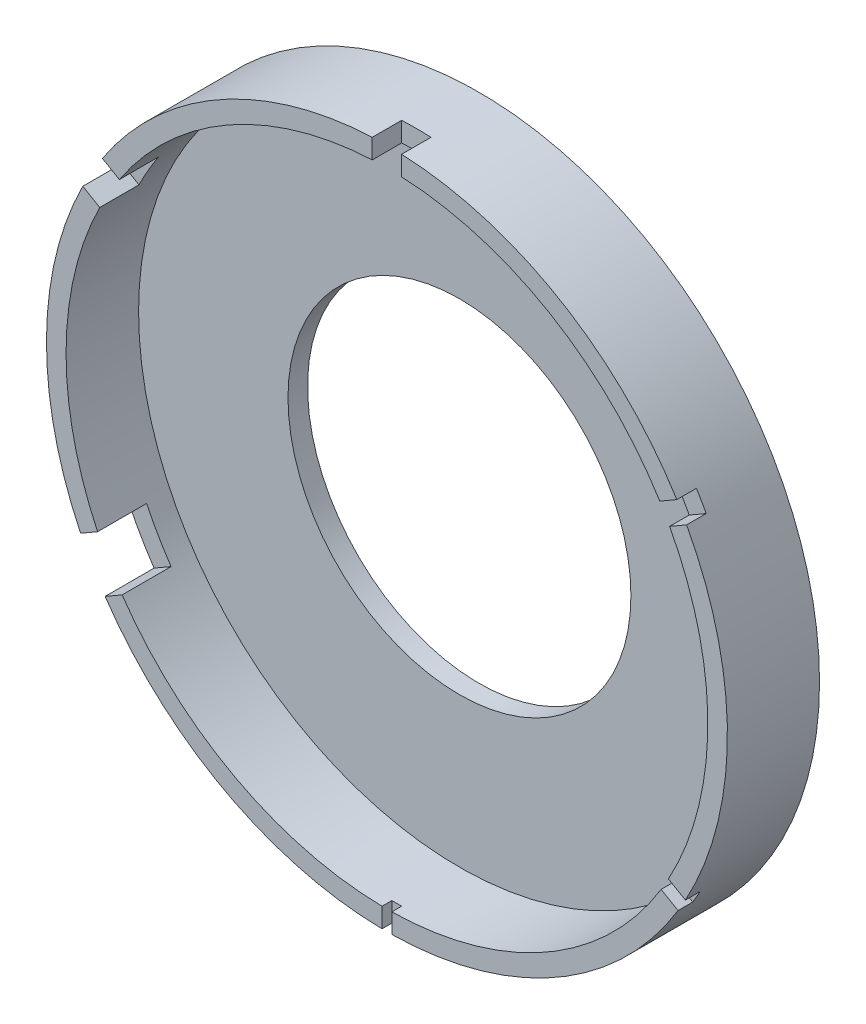
ISO-10303-21;
HEADER;
FILE_DESCRIPTION(('STEP AP214'),'2;1');
FILE_NAME('part.step','',(''),(''),'','','');
FILE_SCHEMA(('AUTOMOTIVE_DESIGN { 1 0 10303 214 1 1 1 1 }'));
ENDSEC;
DATA;
#1=APPLICATION_CONTEXT('core data for automotive mechanical design processes');
#2=APPLICATION_PROTOCOL_DEFINITION('international standard','automotive_design',2000,#1);
#3=PRODUCT_CONTEXT('',#1,'mechanical');
#4=PRODUCT('Part','Part','',(#3));
#5=PRODUCT_RELATED_PRODUCT_CATEGORY('part','',(#4));
#6=PRODUCT_DEFINITION_FORMATION('','',#4);
#7=PRODUCT_DEFINITION_CONTEXT('part definition',#1,'design');
#8=PRODUCT_DEFINITION('design','',#6,#7);
#9=PRODUCT_DEFINITION_SHAPE('','',#8);
#10=(LENGTH_UNIT() NAMED_UNIT(*) SI_UNIT(.MILLI.,.METRE.));
#11=(NAMED_UNIT(*) PLANE_ANGLE_UNIT() SI_UNIT($,.RADIAN.));
#12=(NAMED_UNIT(*) SI_UNIT($,.STERADIAN.) SOLID_ANGLE_UNIT());
#13=UNCERTAINTY_MEASURE_WITH_UNIT(LENGTH_MEASURE(1.E-05),#10,'distance_accuracy_value','');
#14=(GEOMETRIC_REPRESENTATION_CONTEXT(3) GLOBAL_UNCERTAINTY_ASSIGNED_CONTEXT((#13)) GLOBAL_UNIT_ASSIGNED_CONTEXT((#10,
#11,#12)) REPRESENTATION_CONTEXT('',''));
#15=CARTESIAN_POINT('',(0.,0.,0.));
#16=DIRECTION('',(0.,0.,1.));
#17=DIRECTION('',(1.,0.,0.));
#18=AXIS2_PLACEMENT_3D('',#15,#16,#17);
#19=CARTESIAN_POINT('',(0.,0.,9.4));
#20=DIRECTION('',(0.,0.,1.));
#21=DIRECTION('',(1.,0.,0.));
#22=AXIS2_PLACEMENT_3D('',#19,#20,#21);
#23=PLANE('',#22);
#24=DIRECTION('',(-0.866025403784436,-0.500000000000005,0.));
#25=VECTOR('',#24,1.);
#26=CARTESIAN_POINT('',(-29.5295752266542,-14.1621568602162,9.4));
#27=LINE('',#26,#25);
#28=CARTESIAN_POINT('',(-29.5295752266542,-14.1621568602162,9.4));
#29=VERTEX_POINT('',#28);
#30=CARTESIAN_POINT('',(-31.2664017663676,-15.1649141304554,9.4));
#31=VERTEX_POINT('',#30);
#32=EDGE_CURVE('E437',#29,#31,#27,.T.);
#33=ORIENTED_EDGE('',*,*,#32,.F.);
#34=CARTESIAN_POINT('',(0.,0.,9.4));
#35=DIRECTION('',(0.,0.,1.));
#36=DIRECTION('',(1.,0.,0.));
#37=AXIS2_PLACEMENT_3D('',#34,#35,#36);
#38=CIRCLE('',#37,32.75);
#39=CARTESIAN_POINT('',(-29.3093955251609,14.6123863194783,9.4));
#40=VERTEX_POINT('',#39);
#41=EDGE_CURVE('E343',#40,#29,#38,.T.);
#42=ORIENTED_EDGE('',*,*,#41,.F.);
#43=DIRECTION('',(0.866025403784441,-0.499999999999997,0.));
#44=VECTOR('',#43,1.);
#45=CARTESIAN_POINT('',(-29.3093955251609,14.6123863194783,9.4));
#46=LINE('',#45,#44);
#47=CARTESIAN_POINT('',(-31.0444982484315,15.6141483438302,9.4));
#48=VERTEX_POINT('',#47);
#49=EDGE_CURVE('E219',#48,#40,#46,.T.);
#50=ORIENTED_EDGE('',*,*,#49,.F.);
#51=CARTESIAN_POINT('',(0.,0.,9.4));
#52=DIRECTION('',(0.,0.,1.));
#53=DIRECTION('',(1.,0.,0.));
#54=AXIS2_PLACEMENT_3D('',#51,#52,#53);
#55=CIRCLE('',#54,34.75);
#56=EDGE_CURVE('E440',#48,#31,#55,.T.);
#57=ORIENTED_EDGE('',*,*,#56,.T.);
#58=EDGE_LOOP('',(#33,#42,#50,#57));
#59=FACE_BOUND('',#58,.T.);
#60=ADVANCED_FACE('F33',(#59),#23,.T.);
#61=DIRECTION('',(-0.86602540378444,0.499999999999998,0.));
#62=VECTOR('',#61,1.);
#63=CARTESIAN_POINT('',(-27.309395525161,18.076487934616,9.4));
#64=LINE('',#63,#62);
#65=CARTESIAN_POINT('',(-27.309395525161,18.076487934616,9.4));
#66=VERTEX_POINT('',#65);
#67=CARTESIAN_POINT('',(-29.0444982484315,19.0782499589679,9.4));
#68=VERTEX_POINT('',#67);
#69=EDGE_CURVE('E217',#66,#68,#64,.T.);
#70=ORIENTED_EDGE('',*,*,#69,.F.);
#71=CARTESIAN_POINT('',(-1.5,32.715630820756,9.4));
#72=VERTEX_POINT('',#71);
#73=EDGE_CURVE('E339',#72,#66,#38,.T.);
#74=ORIENTED_EDGE('',*,*,#73,.F.);
#75=DIRECTION('',(0.,-1.,0.));
#76=VECTOR('',#75,1.);
#77=CARTESIAN_POINT('',(-1.5,32.715630820756,9.4));
#78=LINE('',#77,#76);
#79=CARTESIAN_POINT('',(-1.5,34.7176108048927,9.4));
#80=VERTEX_POINT('',#79);
#81=EDGE_CURVE('E239',#80,#72,#78,.T.);
#82=ORIENTED_EDGE('',*,*,#81,.F.);
#83=EDGE_CURVE('E451',#80,#68,#55,.T.);
#84=ORIENTED_EDGE('',*,*,#83,.T.);
#85=EDGE_LOOP('',(#70,#74,#82,#84));
#86=FACE_BOUND('',#85,.T.);
#87=ADVANCED_FACE('F427',(#86),#23,.T.);
#88=DIRECTION('',(0.,1.,0.));
#89=VECTOR('',#88,1.);
#90=CARTESIAN_POINT('',(1.5,32.715630820756,9.4));
#91=LINE('',#90,#89);
#92=CARTESIAN_POINT('',(1.5,32.715630820756,9.4));
#93=VERTEX_POINT('',#92);
#94=CARTESIAN_POINT('',(1.5,34.7176108048927,9.4));
#95=VERTEX_POINT('',#94);
#96=EDGE_CURVE('E235',#93,#95,#91,.T.);
#97=ORIENTED_EDGE('',*,*,#96,.F.);
#98=CARTESIAN_POINT('',(27.8491071287967,17.233390035881,9.4));
#99=VERTEX_POINT('',#98);
#100=EDGE_CURVE('E335',#99,#93,#38,.T.);
#101=ORIENTED_EDGE('',*,*,#100,.F.);
#102=DIRECTION('',(-0.866025403784435,-0.500000000000005,0.));
#103=VECTOR('',#102,1.);
#104=CARTESIAN_POINT('',(27.8491071287967,17.233390035881,9.4));
#105=LINE('',#104,#103);
#106=CARTESIAN_POINT('',(29.581919403522,18.2338296691488,9.4));
#107=VERTEX_POINT('',#106);
#108=EDGE_CURVE('E255',#107,#99,#105,.T.);
#109=ORIENTED_EDGE('',*,*,#108,.F.);
#110=EDGE_CURVE('E453',#107,#95,#55,.T.);
#111=ORIENTED_EDGE('',*,*,#110,.T.);
#112=EDGE_LOOP('',(#97,#101,#109,#111));
#113=FACE_BOUND('',#112,.T.);
#114=ADVANCED_FACE('F432',(#113),#23,.T.);
#115=DIRECTION('',(0.866025403784435,0.500000000000007,0.));
#116=VECTOR('',#115,1.);
#117=CARTESIAN_POINT('',(28.8491071287967,15.5013392283122,9.4));
#118=LINE('',#117,#116);
#119=CARTESIAN_POINT('',(28.8491071287967,15.5013392283122,9.4));
#120=VERTEX_POINT('',#119);
#121=CARTESIAN_POINT('',(30.581919403522,16.5017788615799,9.4));
#122=VERTEX_POINT('',#121);
#123=EDGE_CURVE('E251',#120,#122,#118,.T.);
#124=ORIENTED_EDGE('',*,*,#123,.F.);
#125=CARTESIAN_POINT('',(28.7298937575157,-15.7211864909065,9.4));
#126=VERTEX_POINT('',#125);
#127=EDGE_CURVE('E321',#126,#120,#38,.T.);
#128=ORIENTED_EDGE('',*,*,#127,.F.);
#129=DIRECTION('',(-0.86602540378444,0.499999999999998,0.));
#130=VECTOR('',#129,1.);
#131=CARTESIAN_POINT('',(28.7298937575157,-15.7211864909065,9.4));
#132=LINE('',#131,#130);
#133=CARTESIAN_POINT('',(30.4623727666608,-16.7214337132018,9.4));
#134=VERTEX_POINT('',#133);
#135=EDGE_CURVE('E271',#134,#126,#132,.T.);
#136=ORIENTED_EDGE('',*,*,#135,.F.);
#137=EDGE_CURVE('E299',#134,#122,#55,.T.);
#138=ORIENTED_EDGE('',*,*,#137,.T.);
#139=EDGE_LOOP('',(#124,#128,#136,#138));
#140=FACE_BOUND('',#139,.T.);
#141=ADVANCED_FACE('F467',(#140),#23,.T.);
#142=DIRECTION('',(0.86602540378444,-0.499999999999998,0.));
#143=VECTOR('',#142,1.);
#144=CARTESIAN_POINT('',(27.9798937575157,-17.0202245965832,9.4));
#145=LINE('',#144,#143);
#146=CARTESIAN_POINT('',(27.9798937575157,-17.0202245965832,9.4));
#147=VERTEX_POINT('',#146);
#148=CARTESIAN_POINT('',(29.7123727666608,-18.0204718188785,9.4));
#149=VERTEX_POINT('',#148);
#150=EDGE_CURVE('E267',#147,#149,#145,.T.);
#151=ORIENTED_EDGE('',*,*,#150,.F.);
#152=CARTESIAN_POINT('',(0.5,-32.74618298367,9.4));
#153=VERTEX_POINT('',#152);
#154=EDGE_CURVE('E304',#153,#147,#38,.T.);
#155=ORIENTED_EDGE('',*,*,#154,.F.);
#156=DIRECTION('',(0.,1.,0.));
#157=VECTOR('',#156,1.);
#158=CARTESIAN_POINT('',(0.5,-32.74618298367,9.4));
#159=LINE('',#158,#157);
#160=CARTESIAN_POINT('',(0.5,-34.7464026915018,9.4));
#161=VERTEX_POINT('',#160);
#162=EDGE_CURVE('E293',#161,#153,#159,.T.);
#163=ORIENTED_EDGE('',*,*,#162,.F.);
#164=EDGE_CURVE('E295',#161,#149,#55,.T.);
#165=ORIENTED_EDGE('',*,*,#164,.T.);
#166=EDGE_LOOP('',(#151,#155,#163,#165));
#167=FACE_BOUND('',#166,.T.);
#168=ADVANCED_FACE('F386',(#167),#23,.T.);
#169=CARTESIAN_POINT('',(0.,0.,9.4));
#170=DIRECTION('',(0.,0.,-1.));
#171=DIRECTION('',(-1.,0.,0.));
#172=AXIS2_PLACEMENT_3D('',#169,#170,#171);
#173=CYLINDRICAL_SURFACE('',#172,32.75);
#174=DIRECTION('',(0.,0.,1.));
#175=VECTOR('',#174,1.);
#176=CARTESIAN_POINT('',(-29.5295752266542,-14.1621568602162,4.4));
#177=LINE('',#176,#175);
#178=CARTESIAN_POINT('',(-29.5295752266542,-14.1621568602162,4.4));
#179=VERTEX_POINT('',#178);
#180=EDGE_CURVE('E211',#179,#29,#177,.T.);
#181=ORIENTED_EDGE('',*,*,#180,.F.);
#182=CARTESIAN_POINT('',(0.,0.,4.4));
#183=DIRECTION('',(0.,0.,1.));
#184=DIRECTION('',(1.,0.,0.));
#185=AXIS2_PLACEMENT_3D('',#182,#183,#184);
#186=CIRCLE('',#185,32.75);
#187=CARTESIAN_POINT('',(-27.0295752266542,-18.4922838791384,4.4));
#188=VERTEX_POINT('',#187);
#189=EDGE_CURVE('E198',#179,#188,#186,.T.);
#190=ORIENTED_EDGE('',*,*,#189,.T.);
#191=DIRECTION('',(0.,0.,1.));
#192=VECTOR('',#191,1.);
#193=CARTESIAN_POINT('',(-27.0295752266542,-18.4922838791384,4.4));
#194=LINE('',#193,#192);
#195=CARTESIAN_POINT('',(-27.0295752266542,-18.4922838791384,9.4));
#196=VERTEX_POINT('',#195);
#197=EDGE_CURVE('E203',#188,#196,#194,.T.);
#198=ORIENTED_EDGE('',*,*,#197,.T.);
#199=CARTESIAN_POINT('',(-0.5,-32.74618298367,9.4));
#200=VERTEX_POINT('',#199);
#201=EDGE_CURVE('E308',#196,#200,#38,.T.);
#202=ORIENTED_EDGE('',*,*,#201,.T.);
#203=DIRECTION('',(0.,0.,1.));
#204=VECTOR('',#203,1.);
#205=CARTESIAN_POINT('',(-0.5,-32.74618298367,8.4));
#206=LINE('',#205,#204);
#207=CARTESIAN_POINT('',(-0.5,-32.74618298367,8.4));
#208=VERTEX_POINT('',#207);
#209=EDGE_CURVE('E351',#208,#200,#206,.T.);
#210=ORIENTED_EDGE('',*,*,#209,.F.);
#211=CARTESIAN_POINT('',(0.50000000000001,-32.74618298367,8.4));
#212=CARTESIAN_POINT('',(-2.15105711021124E-13,-32.7538174612555,8.4));
#213=CARTESIAN_POINT('',(-0.499999999999998,-32.74618298367,8.4));
#214=B_SPLINE_CURVE_WITH_KNOTS('',2,(#211,#212,#213),.UNSPECIFIED.,.F.,.F.,(3,3),(0.,1.),.UNSPECIFIED.);
#215=CARTESIAN_POINT('',(0.5,-32.74618298367,8.4));
#216=VERTEX_POINT('',#215);
#217=EDGE_CURVE('E309',#216,#208,#214,.T.);
#218=ORIENTED_EDGE('',*,*,#217,.F.);
#219=DIRECTION('',(0.,0.,1.));
#220=VECTOR('',#219,1.);
#221=CARTESIAN_POINT('',(0.5,-32.74618298367,8.4));
#222=LINE('',#221,#220);
#223=EDGE_CURVE('E359',#216,#153,#222,.T.);
#224=ORIENTED_EDGE('',*,*,#223,.T.);
#225=ORIENTED_EDGE('',*,*,#154,.T.);
#226=DIRECTION('',(0.,0.,1.));
#227=VECTOR('',#226,1.);
#228=CARTESIAN_POINT('',(27.9798937575157,-17.0202245965832,7.9));
#229=LINE('',#228,#227);
#230=CARTESIAN_POINT('',(27.9798937575157,-17.0202245965832,7.9));
#231=VERTEX_POINT('',#230);
#232=EDGE_CURVE('E276',#231,#147,#229,.T.);
#233=ORIENTED_EDGE('',*,*,#232,.F.);
#234=CARTESIAN_POINT('',(0.,0.,7.9));
#235=DIRECTION('',(0.,0.,1.));
#236=DIRECTION('',(1.,0.,0.));
#237=AXIS2_PLACEMENT_3D('',#234,#235,#236);
#238=CIRCLE('',#237,32.75);
#239=CARTESIAN_POINT('',(28.7298937575157,-15.7211864909065,7.9));
#240=VERTEX_POINT('',#239);
#241=EDGE_CURVE('E278',#231,#240,#238,.T.);
#242=ORIENTED_EDGE('',*,*,#241,.T.);
#243=DIRECTION('',(0.,0.,1.));
#244=VECTOR('',#243,1.);
#245=CARTESIAN_POINT('',(28.7298937575157,-15.7211864909065,7.9));
#246=LINE('',#245,#244);
#247=EDGE_CURVE('E273',#240,#126,#246,.T.);
#248=ORIENTED_EDGE('',*,*,#247,.T.);
#249=ORIENTED_EDGE('',*,*,#127,.T.);
#250=DIRECTION('',(0.,0.,1.));
#251=VECTOR('',#250,1.);
#252=CARTESIAN_POINT('',(28.8491071287967,15.5013392283122,7.4));
#253=LINE('',#252,#251);
#254=CARTESIAN_POINT('',(28.8491071287967,15.5013392283122,7.4));
#255=VERTEX_POINT('',#254);
#256=EDGE_CURVE('E260',#255,#120,#253,.T.);
#257=ORIENTED_EDGE('',*,*,#256,.F.);
#258=CARTESIAN_POINT('',(0.,0.,7.4));
#259=DIRECTION('',(0.,0.,1.));
#260=DIRECTION('',(1.,0.,0.));
#261=AXIS2_PLACEMENT_3D('',#258,#259,#260);
#262=CIRCLE('',#261,32.75);
#263=CARTESIAN_POINT('',(27.8491071287967,17.233390035881,7.4));
#264=VERTEX_POINT('',#263);
#265=EDGE_CURVE('E262',#255,#264,#262,.T.);
#266=ORIENTED_EDGE('',*,*,#265,.T.);
#267=DIRECTION('',(0.,0.,1.));
#268=VECTOR('',#267,1.);
#269=CARTESIAN_POINT('',(27.8491071287967,17.233390035881,7.4));
#270=LINE('',#269,#268);
#271=EDGE_CURVE('E257',#264,#99,#270,.T.);
#272=ORIENTED_EDGE('',*,*,#271,.T.);
#273=ORIENTED_EDGE('',*,*,#100,.T.);
#274=DIRECTION('',(0.,0.,1.));
#275=VECTOR('',#274,1.);
#276=CARTESIAN_POINT('',(1.5,32.715630820756,6.4));
#277=LINE('',#276,#275);
#278=CARTESIAN_POINT('',(1.5,32.715630820756,6.4));
#279=VERTEX_POINT('',#278);
#280=EDGE_CURVE('E244',#279,#93,#277,.T.);
#281=ORIENTED_EDGE('',*,*,#280,.F.);
#282=CARTESIAN_POINT('',(0.,0.,6.4));
#283=DIRECTION('',(0.,0.,1.));
#284=DIRECTION('',(1.,0.,0.));
#285=AXIS2_PLACEMENT_3D('',#282,#283,#284);
#286=CIRCLE('',#285,32.75);
#287=CARTESIAN_POINT('',(-1.5,32.715630820756,6.4));
#288=VERTEX_POINT('',#287);
#289=EDGE_CURVE('E246',#279,#288,#286,.T.);
#290=ORIENTED_EDGE('',*,*,#289,.T.);
#291=DIRECTION('',(0.,0.,1.));
#292=VECTOR('',#291,1.);
#293=CARTESIAN_POINT('',(-1.5,32.715630820756,6.4));
#294=LINE('',#293,#292);
#295=EDGE_CURVE('E241',#288,#72,#294,.T.);
#296=ORIENTED_EDGE('',*,*,#295,.T.);
#297=ORIENTED_EDGE('',*,*,#73,.T.);
#298=DIRECTION('',(0.,0.,1.));
#299=VECTOR('',#298,1.);
#300=CARTESIAN_POINT('',(-27.309395525161,18.076487934616,5.4));
#301=LINE('',#300,#299);
#302=CARTESIAN_POINT('',(-27.309395525161,18.076487934616,5.4));
#303=VERTEX_POINT('',#302);
#304=EDGE_CURVE('E228',#303,#66,#301,.T.);
#305=ORIENTED_EDGE('',*,*,#304,.F.);
#306=CARTESIAN_POINT('',(0.,0.,5.4));
#307=DIRECTION('',(0.,0.,1.));
#308=DIRECTION('',(1.,0.,0.));
#309=AXIS2_PLACEMENT_3D('',#306,#307,#308);
#310=CIRCLE('',#309,32.75);
#311=CARTESIAN_POINT('',(-29.3093955251609,14.6123863194783,5.4));
#312=VERTEX_POINT('',#311);
#313=EDGE_CURVE('E230',#303,#312,#310,.T.);
#314=ORIENTED_EDGE('',*,*,#313,.T.);
#315=DIRECTION('',(0.,0.,1.));
#316=VECTOR('',#315,1.);
#317=CARTESIAN_POINT('',(-29.3093955251609,14.6123863194783,5.4));
#318=LINE('',#317,#316);
#319=EDGE_CURVE('E225',#312,#40,#318,.T.);
#320=ORIENTED_EDGE('',*,*,#319,.T.);
#321=ORIENTED_EDGE('',*,*,#41,.T.);
#322=EDGE_LOOP('',(#181,#190,#198,#202,#210,#218,#224,#225,#233,#242,#248,#249,#257,#266,#272,
#273,#281,#290,#296,#297,#305,#314,#320,#321));
#323=FACE_BOUND('',#322,.T.);
#324=CARTESIAN_POINT('',(0.,0.,2.));
#325=DIRECTION('',(0.,0.,-1.));
#326=DIRECTION('',(-1.,0.,0.));
#327=AXIS2_PLACEMENT_3D('',#324,#325,#326);
#328=CIRCLE('',#327,32.75);
#329=CARTESIAN_POINT('',(-32.75,0.,2.));
#330=VERTEX_POINT('',#329);
#331=EDGE_CURVE('E305',#330,#330,#328,.T.);
#332=ORIENTED_EDGE('',*,*,#331,.T.);
#333=EDGE_LOOP('',(#332));
#334=FACE_BOUND('',#333,.T.);
#335=ADVANCED_FACE('F214',(#323,#334),#173,.F.);
#336=DIRECTION('',(0.866025403784437,0.500000000000002,0.));
#337=VECTOR('',#336,1.);
#338=CARTESIAN_POINT('',(-27.0295752266542,-18.4922838791384,9.4));
#339=LINE('',#338,#337);
#340=CARTESIAN_POINT('',(-28.7664017663676,-19.4950411493776,9.4));
#341=VERTEX_POINT('',#340);
#342=EDGE_CURVE('E208',#341,#196,#339,.T.);
#343=ORIENTED_EDGE('',*,*,#342,.F.);
#344=CARTESIAN_POINT('',(-0.5,-34.7464026915018,9.4));
#345=VERTEX_POINT('',#344);
#346=EDGE_CURVE('E300',#341,#345,#55,.T.);
#347=ORIENTED_EDGE('',*,*,#346,.T.);
#348=DIRECTION('',(0.,-1.,0.));
#349=VECTOR('',#348,1.);
#350=CARTESIAN_POINT('',(-0.5,-32.74618298367,9.4));
#351=LINE('',#350,#349);
#352=EDGE_CURVE('E283',#200,#345,#351,.T.);
#353=ORIENTED_EDGE('',*,*,#352,.F.);
#354=ORIENTED_EDGE('',*,*,#201,.F.);
#355=EDGE_LOOP('',(#343,#347,#353,#354));
#356=FACE_BOUND('',#355,.T.);
#357=ADVANCED_FACE('F361',(#356),#23,.T.);
#358=CARTESIAN_POINT('',(0.,0.,0.));
#359=DIRECTION('',(0.,0.,1.));
#360=DIRECTION('',(1.,0.,0.));
#361=AXIS2_PLACEMENT_3D('',#358,#359,#360);
#362=PLANE('',#361);
#363=CARTESIAN_POINT('',(0.,0.,0.));
#364=DIRECTION('',(0.,0.,1.));
#365=DIRECTION('',(1.,0.,0.));
#366=AXIS2_PLACEMENT_3D('',#363,#364,#365);
#367=CIRCLE('',#366,17.5);
#368=CARTESIAN_POINT('',(17.5,0.,0.));
#369=VERTEX_POINT('',#368);
#370=EDGE_CURVE('E746',#369,#369,#367,.T.);
#371=ORIENTED_EDGE('',*,*,#370,.T.);
#372=EDGE_LOOP('',(#371));
#373=FACE_BOUND('',#372,.T.);
#374=CARTESIAN_POINT('',(0.,0.,0.));
#375=DIRECTION('',(0.,0.,1.));
#376=DIRECTION('',(1.,0.,0.));
#377=AXIS2_PLACEMENT_3D('',#374,#375,#376);
#378=CIRCLE('',#377,34.75);
#379=CARTESIAN_POINT('',(34.75,0.,0.));
#380=VERTEX_POINT('',#379);
#381=EDGE_CURVE('E301',#380,#380,#378,.T.);
#382=ORIENTED_EDGE('',*,*,#381,.F.);
#383=EDGE_LOOP('',(#382));
#384=FACE_BOUND('',#383,.T.);
#385=ADVANCED_FACE('F416',(#373,#384),#362,.F.);
#386=CARTESIAN_POINT('',(0.,0.,9.4));
#387=DIRECTION('',(0.,0.,-1.));
#388=DIRECTION('',(-1.,0.,0.));
#389=AXIS2_PLACEMENT_3D('',#386,#387,#388);
#390=CYLINDRICAL_SURFACE('',#389,34.75);
#391=CARTESIAN_POINT('',(0.,0.,4.4));
#392=DIRECTION('',(0.,0.,1.));
#393=DIRECTION('',(1.,0.,0.));
#394=AXIS2_PLACEMENT_3D('',#391,#392,#393);
#395=CIRCLE('',#394,34.75);
#396=CARTESIAN_POINT('',(-31.2664017663676,-15.1649141304554,4.4));
#397=VERTEX_POINT('',#396);
#398=CARTESIAN_POINT('',(-28.7664017663676,-19.4950411493776,4.4));
#399=VERTEX_POINT('',#398);
#400=EDGE_CURVE('E200',#397,#399,#395,.T.);
#401=ORIENTED_EDGE('',*,*,#400,.F.);
#402=DIRECTION('',(0.,0.,-1.));
#403=VECTOR('',#402,1.);
#404=CARTESIAN_POINT('',(-31.2664017663676,-15.1649141304554,9.4));
#405=LINE('',#404,#403);
#406=EDGE_CURVE('E11',#397,#31,#405,.F.);
#407=ORIENTED_EDGE('',*,*,#406,.T.);
#408=ORIENTED_EDGE('',*,*,#56,.F.);
#409=DIRECTION('',(0.,0.,-1.));
#410=VECTOR('',#409,1.);
#411=CARTESIAN_POINT('',(-31.0444982484315,15.6141483438302,9.4));
#412=LINE('',#411,#410);
#413=CARTESIAN_POINT('',(-31.0444982484315,15.6141483438302,5.4));
#414=VERTEX_POINT('',#413);
#415=EDGE_CURVE('E449',#48,#414,#412,.T.);
#416=ORIENTED_EDGE('',*,*,#415,.T.);
#417=CARTESIAN_POINT('',(0.,0.,5.4));
#418=DIRECTION('',(0.,0.,1.));
#419=DIRECTION('',(1.,0.,0.));
#420=AXIS2_PLACEMENT_3D('',#417,#418,#419);
#421=CIRCLE('',#420,34.75);
#422=CARTESIAN_POINT('',(-29.0444982484315,19.0782499589679,5.4));
#423=VERTEX_POINT('',#422);
#424=EDGE_CURVE('E495',#423,#414,#421,.T.);
#425=ORIENTED_EDGE('',*,*,#424,.F.);
#426=DIRECTION('',(0.,0.,-1.));
#427=VECTOR('',#426,1.);
#428=CARTESIAN_POINT('',(-29.0444982484315,19.0782499589679,9.4));
#429=LINE('',#428,#427);
#430=EDGE_CURVE('E346',#423,#68,#429,.F.);
#431=ORIENTED_EDGE('',*,*,#430,.T.);
#432=ORIENTED_EDGE('',*,*,#83,.F.);
#433=DIRECTION('',(0.,0.,-1.));
#434=VECTOR('',#433,1.);
#435=CARTESIAN_POINT('',(-1.5,34.7176108048927,9.4));
#436=LINE('',#435,#434);
#437=CARTESIAN_POINT('',(-1.5,34.7176108048927,6.4));
#438=VERTEX_POINT('',#437);
#439=EDGE_CURVE('E478',#80,#438,#436,.T.);
#440=ORIENTED_EDGE('',*,*,#439,.T.);
#441=CARTESIAN_POINT('',(0.,0.,6.4));
#442=DIRECTION('',(0.,0.,1.));
#443=DIRECTION('',(1.,0.,0.));
#444=AXIS2_PLACEMENT_3D('',#441,#442,#443);
#445=CIRCLE('',#444,34.75);
#446=CARTESIAN_POINT('',(1.5,34.7176108048927,6.4));
#447=VERTEX_POINT('',#446);
#448=EDGE_CURVE('E477',#447,#438,#445,.T.);
#449=ORIENTED_EDGE('',*,*,#448,.F.);
#450=DIRECTION('',(0.,0.,-1.));
#451=VECTOR('',#450,1.);
#452=CARTESIAN_POINT('',(1.5,34.7176108048927,9.4));
#453=LINE('',#452,#451);
#454=EDGE_CURVE('E496',#447,#95,#453,.F.);
#455=ORIENTED_EDGE('',*,*,#454,.T.);
#456=ORIENTED_EDGE('',*,*,#110,.F.);
#457=DIRECTION('',(0.,0.,-1.));
#458=VECTOR('',#457,1.);
#459=CARTESIAN_POINT('',(29.581919403522,18.2338296691488,9.4));
#460=LINE('',#459,#458);
#461=CARTESIAN_POINT('',(29.581919403522,18.2338296691488,7.4));
#462=VERTEX_POINT('',#461);
#463=EDGE_CURVE('E398',#107,#462,#460,.T.);
#464=ORIENTED_EDGE('',*,*,#463,.T.);
#465=CARTESIAN_POINT('',(0.,0.,7.4));
#466=DIRECTION('',(0.,0.,1.));
#467=DIRECTION('',(1.,0.,0.));
#468=AXIS2_PLACEMENT_3D('',#465,#466,#467);
#469=CIRCLE('',#468,34.75);
#470=CARTESIAN_POINT('',(30.581919403522,16.5017788615799,7.4));
#471=VERTEX_POINT('',#470);
#472=EDGE_CURVE('E396',#471,#462,#469,.T.);
#473=ORIENTED_EDGE('',*,*,#472,.F.);
#474=DIRECTION('',(0.,0.,-1.));
#475=VECTOR('',#474,1.);
#476=CARTESIAN_POINT('',(30.581919403522,16.5017788615799,9.4));
#477=LINE('',#476,#475);
#478=EDGE_CURVE('E473',#471,#122,#477,.F.);
#479=ORIENTED_EDGE('',*,*,#478,.T.);
#480=ORIENTED_EDGE('',*,*,#137,.F.);
#481=DIRECTION('',(0.,0.,-1.));
#482=VECTOR('',#481,1.);
#483=CARTESIAN_POINT('',(30.4623727666608,-16.7214337132018,9.4));
#484=LINE('',#483,#482);
#485=CARTESIAN_POINT('',(30.4623727666608,-16.7214337132018,7.9));
#486=VERTEX_POINT('',#485);
#487=EDGE_CURVE('E397',#134,#486,#484,.T.);
#488=ORIENTED_EDGE('',*,*,#487,.T.);
#489=CARTESIAN_POINT('',(0.,0.,7.9));
#490=DIRECTION('',(0.,0.,1.));
#491=DIRECTION('',(1.,0.,0.));
#492=AXIS2_PLACEMENT_3D('',#489,#490,#491);
#493=CIRCLE('',#492,34.75);
#494=CARTESIAN_POINT('',(29.7123727666608,-18.0204718188785,7.9));
#495=VERTEX_POINT('',#494);
#496=EDGE_CURVE('E318',#495,#486,#493,.T.);
#497=ORIENTED_EDGE('',*,*,#496,.F.);
#498=DIRECTION('',(0.,0.,-1.));
#499=VECTOR('',#498,1.);
#500=CARTESIAN_POINT('',(29.7123727666608,-18.0204718188785,9.4));
#501=LINE('',#500,#499);
#502=EDGE_CURVE('E392',#495,#149,#501,.F.);
#503=ORIENTED_EDGE('',*,*,#502,.T.);
#504=ORIENTED_EDGE('',*,*,#164,.F.);
#505=DIRECTION('',(0.,0.,-1.));
#506=VECTOR('',#505,1.);
#507=CARTESIAN_POINT('',(0.5,-34.7464026915018,9.4));
#508=LINE('',#507,#506);
#509=CARTESIAN_POINT('',(0.5,-34.7464026915018,8.4));
#510=VERTEX_POINT('',#509);
#511=EDGE_CURVE('E315',#161,#510,#508,.T.);
#512=ORIENTED_EDGE('',*,*,#511,.T.);
#513=CARTESIAN_POINT('',(0.,0.,8.4));
#514=DIRECTION('',(0.,0.,-1.));
#515=DIRECTION('',(-1.,0.,0.));
#516=AXIS2_PLACEMENT_3D('',#513,#514,#515);
#517=CIRCLE('',#516,34.75);
#518=CARTESIAN_POINT('',(-0.5,-34.7464026915018,8.4));
#519=VERTEX_POINT('',#518);
#520=EDGE_CURVE('E298',#510,#519,#517,.T.);
#521=ORIENTED_EDGE('',*,*,#520,.T.);
#522=DIRECTION('',(0.,0.,-1.));
#523=VECTOR('',#522,1.);
#524=CARTESIAN_POINT('',(-0.5,-34.7464026915018,9.4));
#525=LINE('',#524,#523);
#526=EDGE_CURVE('E312',#519,#345,#525,.F.);
#527=ORIENTED_EDGE('',*,*,#526,.T.);
#528=ORIENTED_EDGE('',*,*,#346,.F.);
#529=DIRECTION('',(0.,0.,-1.));
#530=VECTOR('',#529,1.);
#531=CARTESIAN_POINT('',(-28.7664017663676,-19.4950411493776,9.4));
#532=LINE('',#531,#530);
#533=EDGE_CURVE('E42',#341,#399,#532,.T.);
#534=ORIENTED_EDGE('',*,*,#533,.T.);
#535=EDGE_LOOP('',(#401,#407,#408,#416,#425,#431,#432,#440,#449,#455,#456,#464,#473,#479,#480,
#488,#497,#503,#504,#512,#521,#527,#528,#534));
#536=FACE_BOUND('',#535,.T.);
#537=ORIENTED_EDGE('',*,*,#381,.T.);
#538=EDGE_LOOP('',(#537));
#539=FACE_BOUND('',#538,.T.);
#540=ADVANCED_FACE('F35',(#536,#539),#390,.T.);
#541=CARTESIAN_POINT('',(0.,0.,2.));
#542=DIRECTION('',(0.,0.,-1.));
#543=DIRECTION('',(-1.,0.,0.));
#544=AXIS2_PLACEMENT_3D('',#541,#542,#543);
#545=PLANE('',#544);
#546=CARTESIAN_POINT('',(0.,0.,2.));
#547=DIRECTION('',(0.,0.,-1.));
#548=DIRECTION('',(-1.,0.,0.));
#549=AXIS2_PLACEMENT_3D('',#546,#547,#548);
#550=CIRCLE('',#549,17.5);
#551=CARTESIAN_POINT('',(-17.5,0.,2.));
#552=VERTEX_POINT('',#551);
#553=EDGE_CURVE('E37',#552,#552,#550,.T.);
#554=ORIENTED_EDGE('',*,*,#553,.T.);
#555=EDGE_LOOP('',(#554));
#556=FACE_BOUND('',#555,.T.);
#557=ORIENTED_EDGE('',*,*,#331,.F.);
#558=EDGE_LOOP('',(#557));
#559=FACE_BOUND('',#558,.T.);
#560=ADVANCED_FACE('F413',(#556,#559),#545,.F.);
#561=CARTESIAN_POINT('',(0.5,-32.74618298367,8.4));
#562=DIRECTION('',(1.,0.,0.));
#563=DIRECTION('',(0.,1.,0.));
#564=AXIS2_PLACEMENT_3D('',#561,#562,#563);
#565=PLANE('',#564);
#566=ORIENTED_EDGE('',*,*,#162,.T.);
#567=ORIENTED_EDGE('',*,*,#223,.F.);
#568=DIRECTION('',(0.,1.,0.));
#569=VECTOR('',#568,1.);
#570=CARTESIAN_POINT('',(0.5,-32.74618298367,8.4));
#571=LINE('',#570,#569);
#572=EDGE_CURVE('E292',#510,#216,#571,.T.);
#573=ORIENTED_EDGE('',*,*,#572,.F.);
#574=ORIENTED_EDGE('',*,*,#511,.F.);
#575=EDGE_LOOP('',(#566,#567,#573,#574));
#576=FACE_BOUND('',#575,.T.);
#577=ADVANCED_FACE('F381',(#576),#565,.F.);
#578=CARTESIAN_POINT('',(-0.5,-32.74618298367,8.4));
#579=DIRECTION('',(-1.,0.,0.));
#580=DIRECTION('',(0.,-1.,0.));
#581=AXIS2_PLACEMENT_3D('',#578,#579,#580);
#582=PLANE('',#581);
#583=DIRECTION('',(0.,-1.,0.));
#584=VECTOR('',#583,1.);
#585=CARTESIAN_POINT('',(-0.5,-32.74618298367,8.4));
#586=LINE('',#585,#584);
#587=EDGE_CURVE('E289',#208,#519,#586,.T.);
#588=ORIENTED_EDGE('',*,*,#587,.F.);
#589=ORIENTED_EDGE('',*,*,#209,.T.);
#590=ORIENTED_EDGE('',*,*,#352,.T.);
#591=ORIENTED_EDGE('',*,*,#526,.F.);
#592=EDGE_LOOP('',(#588,#589,#590,#591));
#593=FACE_BOUND('',#592,.T.);
#594=ADVANCED_FACE('F356',(#593),#582,.F.);
#595=CARTESIAN_POINT('',(0.,0.,8.4));
#596=DIRECTION('',(0.,0.,-1.));
#597=DIRECTION('',(-1.,0.,0.));
#598=AXIS2_PLACEMENT_3D('',#595,#596,#597);
#599=PLANE('',#598);
#600=ORIENTED_EDGE('',*,*,#217,.T.);
#601=ORIENTED_EDGE('',*,*,#587,.T.);
#602=ORIENTED_EDGE('',*,*,#520,.F.);
#603=ORIENTED_EDGE('',*,*,#572,.T.);
#604=EDGE_LOOP('',(#600,#601,#602,#603));
#605=FACE_BOUND('',#604,.T.);
#606=ADVANCED_FACE('F378',(#605),#599,.F.);
#607=CARTESIAN_POINT('',(27.9798937575157,-17.0202245965832,7.9));
#608=DIRECTION('',(-0.499999999999998,-0.86602540378444,0.));
#609=DIRECTION('',(0.86602540378444,-0.499999999999998,0.));
#610=AXIS2_PLACEMENT_3D('',#607,#608,#609);
#611=PLANE('',#610);
#612=DIRECTION('',(0.86602540378444,-0.499999999999998,0.));
#613=VECTOR('',#612,1.);
#614=CARTESIAN_POINT('',(27.9798937575157,-17.0202245965832,7.9));
#615=LINE('',#614,#613);
#616=EDGE_CURVE('E268',#231,#495,#615,.T.);
#617=ORIENTED_EDGE('',*,*,#616,.F.);
#618=ORIENTED_EDGE('',*,*,#232,.T.);
#619=ORIENTED_EDGE('',*,*,#150,.T.);
#620=ORIENTED_EDGE('',*,*,#502,.F.);
#621=EDGE_LOOP('',(#617,#618,#619,#620));
#622=FACE_BOUND('',#621,.T.);
#623=ADVANCED_FACE('F532',(#622),#611,.F.);
#624=CARTESIAN_POINT('',(28.7298937575157,-15.7211864909065,7.9));
#625=DIRECTION('',(0.499999999999998,0.86602540378444,0.));
#626=DIRECTION('',(-0.86602540378444,0.499999999999998,0.));
#627=AXIS2_PLACEMENT_3D('',#624,#625,#626);
#628=PLANE('',#627);
#629=ORIENTED_EDGE('',*,*,#135,.T.);
#630=ORIENTED_EDGE('',*,*,#247,.F.);
#631=DIRECTION('',(-0.86602540378444,0.499999999999998,0.));
#632=VECTOR('',#631,1.);
#633=CARTESIAN_POINT('',(28.7298937575157,-15.7211864909065,7.9));
#634=LINE('',#633,#632);
#635=EDGE_CURVE('E270',#486,#240,#634,.T.);
#636=ORIENTED_EDGE('',*,*,#635,.F.);
#637=ORIENTED_EDGE('',*,*,#487,.F.);
#638=EDGE_LOOP('',(#629,#630,#636,#637));
#639=FACE_BOUND('',#638,.T.);
#640=ADVANCED_FACE('F528',(#639),#628,.F.);
#641=CARTESIAN_POINT('',(0.,0.,7.9));
#642=DIRECTION('',(0.,0.,1.));
#643=DIRECTION('',(1.,0.,0.));
#644=AXIS2_PLACEMENT_3D('',#641,#642,#643);
#645=PLANE('',#644);
#646=ORIENTED_EDGE('',*,*,#616,.T.);
#647=ORIENTED_EDGE('',*,*,#496,.T.);
#648=ORIENTED_EDGE('',*,*,#635,.T.);
#649=ORIENTED_EDGE('',*,*,#241,.F.);
#650=EDGE_LOOP('',(#646,#647,#648,#649));
#651=FACE_BOUND('',#650,.T.);
#652=ADVANCED_FACE('F525',(#651),#645,.T.);
#653=CARTESIAN_POINT('',(28.8491071287967,15.5013392283122,7.4));
#654=DIRECTION('',(0.500000000000007,-0.866025403784435,0.));
#655=DIRECTION('',(0.866025403784435,0.500000000000007,0.));
#656=AXIS2_PLACEMENT_3D('',#653,#654,#655);
#657=PLANE('',#656);
#658=DIRECTION('',(0.866025403784435,0.500000000000007,0.));
#659=VECTOR('',#658,1.);
#660=CARTESIAN_POINT('',(28.8491071287967,15.5013392283122,7.4));
#661=LINE('',#660,#659);
#662=EDGE_CURVE('E252',#255,#471,#661,.T.);
#663=ORIENTED_EDGE('',*,*,#662,.F.);
#664=ORIENTED_EDGE('',*,*,#256,.T.);
#665=ORIENTED_EDGE('',*,*,#123,.T.);
#666=ORIENTED_EDGE('',*,*,#478,.F.);
#667=EDGE_LOOP('',(#663,#664,#665,#666));
#668=FACE_BOUND('',#667,.T.);
#669=ADVANCED_FACE('F522',(#668),#657,.F.);
#670=CARTESIAN_POINT('',(27.8491071287967,17.233390035881,7.4));
#671=DIRECTION('',(-0.500000000000005,0.866025403784436,0.));
#672=DIRECTION('',(-0.866025403784436,-0.500000000000005,0.));
#673=AXIS2_PLACEMENT_3D('',#670,#671,#672);
#674=PLANE('',#673);
#675=ORIENTED_EDGE('',*,*,#108,.T.);
#676=ORIENTED_EDGE('',*,*,#271,.F.);
#677=DIRECTION('',(-0.866025403784435,-0.500000000000005,0.));
#678=VECTOR('',#677,1.);
#679=CARTESIAN_POINT('',(27.8491071287967,17.233390035881,7.4));
#680=LINE('',#679,#678);
#681=EDGE_CURVE('E254',#462,#264,#680,.T.);
#682=ORIENTED_EDGE('',*,*,#681,.F.);
#683=ORIENTED_EDGE('',*,*,#463,.F.);
#684=EDGE_LOOP('',(#675,#676,#682,#683));
#685=FACE_BOUND('',#684,.T.);
#686=ADVANCED_FACE('F483',(#685),#674,.F.);
#687=CARTESIAN_POINT('',(0.,0.,7.4));
#688=DIRECTION('',(0.,0.,1.));
#689=DIRECTION('',(1.,0.,0.));
#690=AXIS2_PLACEMENT_3D('',#687,#688,#689);
#691=PLANE('',#690);
#692=ORIENTED_EDGE('',*,*,#662,.T.);
#693=ORIENTED_EDGE('',*,*,#472,.T.);
#694=ORIENTED_EDGE('',*,*,#681,.T.);
#695=ORIENTED_EDGE('',*,*,#265,.F.);
#696=EDGE_LOOP('',(#692,#693,#694,#695));
#697=FACE_BOUND('',#696,.T.);
#698=ADVANCED_FACE('F509',(#697),#691,.T.);
#699=CARTESIAN_POINT('',(1.5,32.715630820756,6.4));
#700=DIRECTION('',(1.,0.,0.));
#701=DIRECTION('',(0.,1.,0.));
#702=AXIS2_PLACEMENT_3D('',#699,#700,#701);
#703=PLANE('',#702);
#704=DIRECTION('',(0.,1.,0.));
#705=VECTOR('',#704,1.);
#706=CARTESIAN_POINT('',(1.5,32.715630820756,6.4));
#707=LINE('',#706,#705);
#708=EDGE_CURVE('E236',#279,#447,#707,.T.);
#709=ORIENTED_EDGE('',*,*,#708,.F.);
#710=ORIENTED_EDGE('',*,*,#280,.T.);
#711=ORIENTED_EDGE('',*,*,#96,.T.);
#712=ORIENTED_EDGE('',*,*,#454,.F.);
#713=EDGE_LOOP('',(#709,#710,#711,#712));
#714=FACE_BOUND('',#713,.T.);
#715=ADVANCED_FACE('F507',(#714),#703,.F.);
#716=CARTESIAN_POINT('',(-1.5,32.715630820756,6.4));
#717=DIRECTION('',(-1.,0.,0.));
#718=DIRECTION('',(0.,-1.,0.));
#719=AXIS2_PLACEMENT_3D('',#716,#717,#718);
#720=PLANE('',#719);
#721=ORIENTED_EDGE('',*,*,#81,.T.);
#722=ORIENTED_EDGE('',*,*,#295,.F.);
#723=DIRECTION('',(0.,-1.,0.));
#724=VECTOR('',#723,1.);
#725=CARTESIAN_POINT('',(-1.5,32.715630820756,6.4));
#726=LINE('',#725,#724);
#727=EDGE_CURVE('E238',#438,#288,#726,.T.);
#728=ORIENTED_EDGE('',*,*,#727,.F.);
#729=ORIENTED_EDGE('',*,*,#439,.F.);
#730=EDGE_LOOP('',(#721,#722,#728,#729));
#731=FACE_BOUND('',#730,.T.);
#732=ADVANCED_FACE('F502',(#731),#720,.F.);
#733=CARTESIAN_POINT('',(0.,0.,6.4));
#734=DIRECTION('',(0.,0.,1.));
#735=DIRECTION('',(1.,0.,0.));
#736=AXIS2_PLACEMENT_3D('',#733,#734,#735);
#737=PLANE('',#736);
#738=ORIENTED_EDGE('',*,*,#708,.T.);
#739=ORIENTED_EDGE('',*,*,#448,.T.);
#740=ORIENTED_EDGE('',*,*,#727,.T.);
#741=ORIENTED_EDGE('',*,*,#289,.F.);
#742=EDGE_LOOP('',(#738,#739,#740,#741));
#743=FACE_BOUND('',#742,.T.);
#744=ADVANCED_FACE('F504',(#743),#737,.T.);
#745=CARTESIAN_POINT('',(-27.309395525161,18.076487934616,5.4));
#746=DIRECTION('',(0.499999999999998,0.86602540378444,0.));
#747=DIRECTION('',(-0.86602540378444,0.499999999999998,0.));
#748=AXIS2_PLACEMENT_3D('',#745,#746,#747);
#749=PLANE('',#748);
#750=DIRECTION('',(-0.86602540378444,0.499999999999998,0.));
#751=VECTOR('',#750,1.);
#752=CARTESIAN_POINT('',(-27.309395525161,18.076487934616,5.4));
#753=LINE('',#752,#751);
#754=EDGE_CURVE('E58',#303,#423,#753,.T.);
#755=ORIENTED_EDGE('',*,*,#754,.F.);
#756=ORIENTED_EDGE('',*,*,#304,.T.);
#757=ORIENTED_EDGE('',*,*,#69,.T.);
#758=ORIENTED_EDGE('',*,*,#430,.F.);
#759=EDGE_LOOP('',(#755,#756,#757,#758));
#760=FACE_BOUND('',#759,.T.);
#761=ADVANCED_FACE('F493',(#760),#749,.F.);
#762=CARTESIAN_POINT('',(-29.3093955251609,14.6123863194783,5.4));
#763=DIRECTION('',(-0.499999999999997,-0.866025403784441,0.));
#764=DIRECTION('',(0.866025403784441,-0.499999999999997,0.));
#765=AXIS2_PLACEMENT_3D('',#762,#763,#764);
#766=PLANE('',#765);
#767=ORIENTED_EDGE('',*,*,#49,.T.);
#768=ORIENTED_EDGE('',*,*,#319,.F.);
#769=DIRECTION('',(0.866025403784441,-0.499999999999997,0.));
#770=VECTOR('',#769,1.);
#771=CARTESIAN_POINT('',(-29.3093955251609,14.6123863194783,5.4));
#772=LINE('',#771,#770);
#773=EDGE_CURVE('E224',#414,#312,#772,.T.);
#774=ORIENTED_EDGE('',*,*,#773,.F.);
#775=ORIENTED_EDGE('',*,*,#415,.F.);
#776=EDGE_LOOP('',(#767,#768,#774,#775));
#777=FACE_BOUND('',#776,.T.);
#778=ADVANCED_FACE('F447',(#777),#766,.F.);
#779=CARTESIAN_POINT('',(0.,0.,5.4));
#780=DIRECTION('',(0.,0.,1.));
#781=DIRECTION('',(1.,0.,0.));
#782=AXIS2_PLACEMENT_3D('',#779,#780,#781);
#783=PLANE('',#782);
#784=ORIENTED_EDGE('',*,*,#754,.T.);
#785=ORIENTED_EDGE('',*,*,#424,.T.);
#786=ORIENTED_EDGE('',*,*,#773,.T.);
#787=ORIENTED_EDGE('',*,*,#313,.F.);
#788=EDGE_LOOP('',(#784,#785,#786,#787));
#789=FACE_BOUND('',#788,.T.);
#790=ADVANCED_FACE('F631',(#789),#783,.T.);
#791=CARTESIAN_POINT('',(-29.5295752266542,-14.1621568602162,4.4));
#792=DIRECTION('',(-0.500000000000005,0.866025403784436,0.));
#793=DIRECTION('',(-0.866025403784436,-0.500000000000005,0.));
#794=AXIS2_PLACEMENT_3D('',#791,#792,#793);
#795=PLANE('',#794);
#796=DIRECTION('',(-0.866025403784436,-0.500000000000005,0.));
#797=VECTOR('',#796,1.);
#798=CARTESIAN_POINT('',(-29.5295752266542,-14.1621568602162,4.4));
#799=LINE('',#798,#797);
#800=EDGE_CURVE('E50',#179,#397,#799,.T.);
#801=ORIENTED_EDGE('',*,*,#800,.F.);
#802=ORIENTED_EDGE('',*,*,#180,.T.);
#803=ORIENTED_EDGE('',*,*,#32,.T.);
#804=ORIENTED_EDGE('',*,*,#406,.F.);
#805=EDGE_LOOP('',(#801,#802,#803,#804));
#806=FACE_BOUND('',#805,.T.);
#807=ADVANCED_FACE('F639',(#806),#795,.F.);
#808=CARTESIAN_POINT('',(-27.0295752266542,-18.4922838791384,4.4));
#809=DIRECTION('',(0.500000000000002,-0.866025403784437,0.));
#810=DIRECTION('',(0.866025403784437,0.500000000000002,0.));
#811=AXIS2_PLACEMENT_3D('',#808,#809,#810);
#812=PLANE('',#811);
#813=ORIENTED_EDGE('',*,*,#342,.T.);
#814=ORIENTED_EDGE('',*,*,#197,.F.);
#815=DIRECTION('',(0.866025403784437,0.500000000000002,0.));
#816=VECTOR('',#815,1.);
#817=CARTESIAN_POINT('',(-27.0295752266542,-18.4922838791384,4.4));
#818=LINE('',#817,#816);
#819=EDGE_CURVE('E194',#399,#188,#818,.T.);
#820=ORIENTED_EDGE('',*,*,#819,.F.);
#821=ORIENTED_EDGE('',*,*,#533,.F.);
#822=EDGE_LOOP('',(#813,#814,#820,#821));
#823=FACE_BOUND('',#822,.T.);
#824=ADVANCED_FACE('F206',(#823),#812,.F.);
#825=CARTESIAN_POINT('',(0.,0.,4.4));
#826=DIRECTION('',(0.,0.,1.));
#827=DIRECTION('',(1.,0.,0.));
#828=AXIS2_PLACEMENT_3D('',#825,#826,#827);
#829=PLANE('',#828);
#830=ORIENTED_EDGE('',*,*,#800,.T.);
#831=ORIENTED_EDGE('',*,*,#400,.T.);
#832=ORIENTED_EDGE('',*,*,#819,.T.);
#833=ORIENTED_EDGE('',*,*,#189,.F.);
#834=EDGE_LOOP('',(#830,#831,#832,#833));
#835=FACE_BOUND('',#834,.T.);
#836=ADVANCED_FACE('F196',(#835),#829,.T.);
#837=CARTESIAN_POINT('',(0.,0.,0.));
#838=DIRECTION('',(0.,0.,1.));
#839=DIRECTION('',(1.,0.,0.));
#840=AXIS2_PLACEMENT_3D('',#837,#838,#839);
#841=CYLINDRICAL_SURFACE('',#840,17.5);
#842=ORIENTED_EDGE('',*,*,#370,.F.);
#843=EDGE_LOOP('',(#842));
#844=FACE_BOUND('',#843,.T.);
#845=ORIENTED_EDGE('',*,*,#553,.F.);
#846=EDGE_LOOP('',(#845));
#847=FACE_BOUND('',#846,.T.);
#848=ADVANCED_FACE('F688',(#844,#847),#841,.F.);
#849=CLOSED_SHELL('',(#60,#87,#114,#141,#168,#335,#357,#385,#540,#560,#577,#594,#606,#623,#640,
#652,#669,#686,#698,#715,#732,#744,#761,#778,#790,#807,#824,#836,#848));
#850=MANIFOLD_SOLID_BREP('B2',#849);
#851=ADVANCED_BREP_SHAPE_REPRESENTATION('',(#18,#850),#14);
#852=SHAPE_DEFINITION_REPRESENTATION(#9,#851);
ENDSEC;
END-ISO-10303-21;
